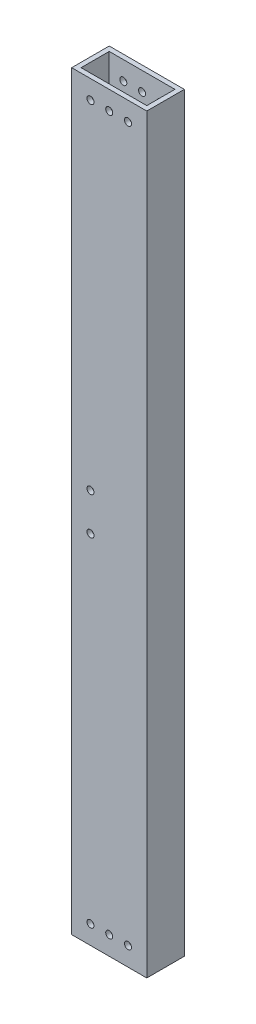
ISO-10303-21;
HEADER;
FILE_DESCRIPTION(('STEP AP214'),'2;1');
FILE_NAME('part.step','',(''),(''),'','','');
FILE_SCHEMA(('AUTOMOTIVE_DESIGN { 1 0 10303 214 1 1 1 1 }'));
ENDSEC;
DATA;
#1=APPLICATION_CONTEXT('core data for automotive mechanical design processes');
#2=APPLICATION_PROTOCOL_DEFINITION('international standard','automotive_design',2000,#1);
#3=PRODUCT_CONTEXT('',#1,'mechanical');
#4=PRODUCT('Part','Part','',(#3));
#5=PRODUCT_RELATED_PRODUCT_CATEGORY('part','',(#4));
#6=PRODUCT_DEFINITION_FORMATION('','',#4);
#7=PRODUCT_DEFINITION_CONTEXT('part definition',#1,'design');
#8=PRODUCT_DEFINITION('design','',#6,#7);
#9=PRODUCT_DEFINITION_SHAPE('','',#8);
#10=(LENGTH_UNIT() NAMED_UNIT(*) SI_UNIT(.MILLI.,.METRE.));
#11=(NAMED_UNIT(*) PLANE_ANGLE_UNIT() SI_UNIT($,.RADIAN.));
#12=(NAMED_UNIT(*) SI_UNIT($,.STERADIAN.) SOLID_ANGLE_UNIT());
#13=UNCERTAINTY_MEASURE_WITH_UNIT(LENGTH_MEASURE(1.E-05),#10,'distance_accuracy_value','');
#14=(GEOMETRIC_REPRESENTATION_CONTEXT(3) GLOBAL_UNCERTAINTY_ASSIGNED_CONTEXT((#13)) GLOBAL_UNIT_ASSIGNED_CONTEXT((#10,
#11,#12)) REPRESENTATION_CONTEXT('',''));
#15=CARTESIAN_POINT('',(0.,0.,0.));
#16=DIRECTION('',(0.,0.,1.));
#17=DIRECTION('',(1.,0.,0.));
#18=AXIS2_PLACEMENT_3D('',#15,#16,#17);
#19=CARTESIAN_POINT('',(25.4,254.,-12.7));
#20=DIRECTION('',(-1.,0.,0.));
#21=DIRECTION('',(0.,0.,1.));
#22=AXIS2_PLACEMENT_3D('',#19,#20,#21);
#23=PLANE('',#22);
#24=DIRECTION('',(0.,0.,-1.));
#25=VECTOR('',#24,1.);
#26=CARTESIAN_POINT('',(25.4,-254.,-12.7));
#27=LINE('',#26,#25);
#28=CARTESIAN_POINT('',(25.4,-254.,12.7));
#29=VERTEX_POINT('',#28);
#30=CARTESIAN_POINT('',(25.4,-254.,-12.7));
#31=VERTEX_POINT('',#30);
#32=EDGE_CURVE('E148',#29,#31,#27,.T.);
#33=ORIENTED_EDGE('',*,*,#32,.T.);
#34=DIRECTION('',(0.,-1.,0.));
#35=VECTOR('',#34,1.);
#36=CARTESIAN_POINT('',(25.4,254.,-12.7));
#37=LINE('',#36,#35);
#38=CARTESIAN_POINT('',(25.4,254.,-12.7));
#39=VERTEX_POINT('',#38);
#40=EDGE_CURVE('E11',#39,#31,#37,.T.);
#41=ORIENTED_EDGE('',*,*,#40,.F.);
#42=DIRECTION('',(0.,0.,-1.));
#43=VECTOR('',#42,1.);
#44=CARTESIAN_POINT('',(25.4,254.,-12.7));
#45=LINE('',#44,#43);
#46=CARTESIAN_POINT('',(25.4,254.,12.7));
#47=VERTEX_POINT('',#46);
#48=EDGE_CURVE('E137',#47,#39,#45,.T.);
#49=ORIENTED_EDGE('',*,*,#48,.F.);
#50=DIRECTION('',(0.,-1.,0.));
#51=VECTOR('',#50,1.);
#52=CARTESIAN_POINT('',(25.4,254.,12.7));
#53=LINE('',#52,#51);
#54=EDGE_CURVE('E147',#47,#29,#53,.T.);
#55=ORIENTED_EDGE('',*,*,#54,.T.);
#56=EDGE_LOOP('',(#33,#41,#49,#55));
#57=FACE_BOUND('',#56,.T.);
#58=ADVANCED_FACE('F37',(#57),#23,.F.);
#59=CARTESIAN_POINT('',(-25.4,254.,-12.7));
#60=DIRECTION('',(0.,0.,1.));
#61=DIRECTION('',(1.,0.,0.));
#62=AXIS2_PLACEMENT_3D('',#59,#60,#61);
#63=PLANE('',#62);
#64=CARTESIAN_POINT('',(-12.7,-241.3,-12.7));
#65=DIRECTION('',(0.,0.,-1.));
#66=DIRECTION('',(-1.,0.,0.));
#67=AXIS2_PLACEMENT_3D('',#64,#65,#66);
#68=CIRCLE('',#67,2.38125);
#69=CARTESIAN_POINT('',(-15.08125,-241.3,-12.7));
#70=VERTEX_POINT('',#69);
#71=EDGE_CURVE('E362',#70,#70,#68,.T.);
#72=ORIENTED_EDGE('',*,*,#71,.F.);
#73=EDGE_LOOP('',(#72));
#74=FACE_BOUND('',#73,.T.);
#75=CARTESIAN_POINT('',(12.7,-241.3,-12.7));
#76=DIRECTION('',(0.,0.,-1.));
#77=DIRECTION('',(-1.,0.,0.));
#78=AXIS2_PLACEMENT_3D('',#75,#76,#77);
#79=CIRCLE('',#78,2.38125);
#80=CARTESIAN_POINT('',(10.31875,-241.3,-12.7));
#81=VERTEX_POINT('',#80);
#82=EDGE_CURVE('E390',#81,#81,#79,.T.);
#83=ORIENTED_EDGE('',*,*,#82,.F.);
#84=EDGE_LOOP('',(#83));
#85=FACE_BOUND('',#84,.T.);
#86=CARTESIAN_POINT('',(12.6999999999999,241.3,-12.7));
#87=DIRECTION('',(0.,0.,-1.));
#88=DIRECTION('',(1.,0.,0.));
#89=AXIS2_PLACEMENT_3D('',#86,#87,#88);
#90=CIRCLE('',#89,2.38125);
#91=CARTESIAN_POINT('',(15.0812499999999,241.3,-12.7));
#92=VERTEX_POINT('',#91);
#93=EDGE_CURVE('E396',#92,#92,#90,.T.);
#94=ORIENTED_EDGE('',*,*,#93,.F.);
#95=EDGE_LOOP('',(#94));
#96=FACE_BOUND('',#95,.T.);
#97=CARTESIAN_POINT('',(-12.6999999999999,241.3,-12.7));
#98=DIRECTION('',(0.,0.,-1.));
#99=DIRECTION('',(1.,0.,0.));
#100=AXIS2_PLACEMENT_3D('',#97,#98,#99);
#101=CIRCLE('',#100,2.38125);
#102=CARTESIAN_POINT('',(-10.3187499999999,241.3,-12.7));
#103=VERTEX_POINT('',#102);
#104=EDGE_CURVE('E384',#103,#103,#101,.T.);
#105=ORIENTED_EDGE('',*,*,#104,.F.);
#106=EDGE_LOOP('',(#105));
#107=FACE_BOUND('',#106,.T.);
#108=CARTESIAN_POINT('',(0.,241.3,-12.7));
#109=DIRECTION('',(0.,0.,-1.));
#110=DIRECTION('',(1.,0.,0.));
#111=AXIS2_PLACEMENT_3D('',#108,#109,#110);
#112=CIRCLE('',#111,2.38125);
#113=CARTESIAN_POINT('',(2.38125000000006,241.3,-12.7));
#114=VERTEX_POINT('',#113);
#115=EDGE_CURVE('E378',#114,#114,#112,.T.);
#116=ORIENTED_EDGE('',*,*,#115,.F.);
#117=EDGE_LOOP('',(#116));
#118=FACE_BOUND('',#117,.T.);
#119=CARTESIAN_POINT('',(0.,-241.3,-12.7));
#120=DIRECTION('',(0.,0.,-1.));
#121=DIRECTION('',(-1.,0.,0.));
#122=AXIS2_PLACEMENT_3D('',#119,#120,#121);
#123=CIRCLE('',#122,2.38125);
#124=CARTESIAN_POINT('',(-2.38125,-241.3,-12.7));
#125=VERTEX_POINT('',#124);
#126=EDGE_CURVE('E360',#125,#125,#123,.T.);
#127=ORIENTED_EDGE('',*,*,#126,.F.);
#128=EDGE_LOOP('',(#127));
#129=FACE_BOUND('',#128,.T.);
#130=CARTESIAN_POINT('',(-12.7,-12.7,-12.7));
#131=DIRECTION('',(0.,0.,-1.));
#132=DIRECTION('',(-1.,0.,0.));
#133=AXIS2_PLACEMENT_3D('',#130,#131,#132);
#134=CIRCLE('',#133,2.38125);
#135=CARTESIAN_POINT('',(-15.08125,-12.7,-12.7));
#136=VERTEX_POINT('',#135);
#137=EDGE_CURVE('E207',#136,#136,#134,.T.);
#138=ORIENTED_EDGE('',*,*,#137,.F.);
#139=EDGE_LOOP('',(#138));
#140=FACE_BOUND('',#139,.T.);
#141=CARTESIAN_POINT('',(-12.7,12.7,-12.7));
#142=DIRECTION('',(0.,0.,-1.));
#143=DIRECTION('',(-1.,0.,0.));
#144=AXIS2_PLACEMENT_3D('',#141,#142,#143);
#145=CIRCLE('',#144,2.38125);
#146=CARTESIAN_POINT('',(-15.08125,12.7,-12.7));
#147=VERTEX_POINT('',#146);
#148=EDGE_CURVE('E210',#147,#147,#145,.T.);
#149=ORIENTED_EDGE('',*,*,#148,.F.);
#150=EDGE_LOOP('',(#149));
#151=FACE_BOUND('',#150,.T.);
#152=DIRECTION('',(-1.,0.,0.));
#153=VECTOR('',#152,1.);
#154=CARTESIAN_POINT('',(-25.4,-254.,-12.7));
#155=LINE('',#154,#153);
#156=CARTESIAN_POINT('',(-25.4,-254.,-12.7));
#157=VERTEX_POINT('',#156);
#158=EDGE_CURVE('E151',#31,#157,#155,.T.);
#159=ORIENTED_EDGE('',*,*,#158,.T.);
#160=DIRECTION('',(0.,-1.,0.));
#161=VECTOR('',#160,1.);
#162=CARTESIAN_POINT('',(-25.4,254.,-12.7));
#163=LINE('',#162,#161);
#164=CARTESIAN_POINT('',(-25.4,254.,-12.7));
#165=VERTEX_POINT('',#164);
#166=EDGE_CURVE('E45',#165,#157,#163,.T.);
#167=ORIENTED_EDGE('',*,*,#166,.F.);
#168=DIRECTION('',(-1.,0.,0.));
#169=VECTOR('',#168,1.);
#170=CARTESIAN_POINT('',(-25.4,254.,-12.7));
#171=LINE('',#170,#169);
#172=EDGE_CURVE('E140',#39,#165,#171,.T.);
#173=ORIENTED_EDGE('',*,*,#172,.F.);
#174=ORIENTED_EDGE('',*,*,#40,.T.);
#175=EDGE_LOOP('',(#159,#167,#173,#174));
#176=FACE_BOUND('',#175,.T.);
#177=ADVANCED_FACE('F241',(#74,#85,#96,#107,#118,#129,#140,#151,#176),#63,.F.);
#178=CARTESIAN_POINT('',(-25.4,254.,-12.7));
#179=DIRECTION('',(1.,0.,0.));
#180=DIRECTION('',(0.,0.,-1.));
#181=AXIS2_PLACEMENT_3D('',#178,#179,#180);
#182=PLANE('',#181);
#183=DIRECTION('',(0.,0.,1.));
#184=VECTOR('',#183,1.);
#185=CARTESIAN_POINT('',(-25.4,-254.,-12.7));
#186=LINE('',#185,#184);
#187=CARTESIAN_POINT('',(-25.4,-254.,12.7));
#188=VERTEX_POINT('',#187);
#189=EDGE_CURVE('E153',#157,#188,#186,.T.);
#190=ORIENTED_EDGE('',*,*,#189,.T.);
#191=DIRECTION('',(0.,-1.,0.));
#192=VECTOR('',#191,1.);
#193=CARTESIAN_POINT('',(-25.4,254.,12.7));
#194=LINE('',#193,#192);
#195=CARTESIAN_POINT('',(-25.4,254.,12.7));
#196=VERTEX_POINT('',#195);
#197=EDGE_CURVE('E158',#196,#188,#194,.T.);
#198=ORIENTED_EDGE('',*,*,#197,.F.);
#199=DIRECTION('',(0.,0.,1.));
#200=VECTOR('',#199,1.);
#201=CARTESIAN_POINT('',(-25.4,254.,-12.7));
#202=LINE('',#201,#200);
#203=EDGE_CURVE('E143',#165,#196,#202,.T.);
#204=ORIENTED_EDGE('',*,*,#203,.F.);
#205=ORIENTED_EDGE('',*,*,#166,.T.);
#206=EDGE_LOOP('',(#190,#198,#204,#205));
#207=FACE_BOUND('',#206,.T.);
#208=ADVANCED_FACE('F246',(#207),#182,.F.);
#209=CARTESIAN_POINT('',(-25.4,254.,12.7));
#210=DIRECTION('',(0.,0.,-1.));
#211=DIRECTION('',(-1.,0.,0.));
#212=AXIS2_PLACEMENT_3D('',#209,#210,#211);
#213=PLANE('',#212);
#214=CARTESIAN_POINT('',(-12.7,-241.3,12.7));
#215=DIRECTION('',(0.,0.,-1.));
#216=DIRECTION('',(-1.,0.,0.));
#217=AXIS2_PLACEMENT_3D('',#214,#215,#216);
#218=CIRCLE('',#217,2.38125);
#219=CARTESIAN_POINT('',(-15.08125,-241.3,12.7));
#220=VERTEX_POINT('',#219);
#221=EDGE_CURVE('E367',#220,#220,#218,.T.);
#222=ORIENTED_EDGE('',*,*,#221,.T.);
#223=EDGE_LOOP('',(#222));
#224=FACE_BOUND('',#223,.T.);
#225=CARTESIAN_POINT('',(12.7,-241.3,12.7));
#226=DIRECTION('',(0.,0.,-1.));
#227=DIRECTION('',(-1.,0.,0.));
#228=AXIS2_PLACEMENT_3D('',#225,#226,#227);
#229=CIRCLE('',#228,2.38125);
#230=CARTESIAN_POINT('',(10.31875,-241.3,12.7));
#231=VERTEX_POINT('',#230);
#232=EDGE_CURVE('E393',#231,#231,#229,.T.);
#233=ORIENTED_EDGE('',*,*,#232,.T.);
#234=EDGE_LOOP('',(#233));
#235=FACE_BOUND('',#234,.T.);
#236=CARTESIAN_POINT('',(12.6999999999999,241.3,12.7));
#237=DIRECTION('',(0.,0.,-1.));
#238=DIRECTION('',(1.,0.,0.));
#239=AXIS2_PLACEMENT_3D('',#236,#237,#238);
#240=CIRCLE('',#239,2.38125);
#241=CARTESIAN_POINT('',(15.0812499999999,241.3,12.7));
#242=VERTEX_POINT('',#241);
#243=EDGE_CURVE('E399',#242,#242,#240,.T.);
#244=ORIENTED_EDGE('',*,*,#243,.T.);
#245=EDGE_LOOP('',(#244));
#246=FACE_BOUND('',#245,.T.);
#247=CARTESIAN_POINT('',(-12.6999999999999,241.3,12.7));
#248=DIRECTION('',(0.,0.,-1.));
#249=DIRECTION('',(1.,0.,0.));
#250=AXIS2_PLACEMENT_3D('',#247,#248,#249);
#251=CIRCLE('',#250,2.38125);
#252=CARTESIAN_POINT('',(-10.3187499999999,241.3,12.7));
#253=VERTEX_POINT('',#252);
#254=EDGE_CURVE('E380',#253,#253,#251,.T.);
#255=ORIENTED_EDGE('',*,*,#254,.T.);
#256=EDGE_LOOP('',(#255));
#257=FACE_BOUND('',#256,.T.);
#258=CARTESIAN_POINT('',(0.,241.3,12.7));
#259=DIRECTION('',(0.,0.,-1.));
#260=DIRECTION('',(1.,0.,0.));
#261=AXIS2_PLACEMENT_3D('',#258,#259,#260);
#262=CIRCLE('',#261,2.38125);
#263=CARTESIAN_POINT('',(2.38125000000006,241.3,12.7));
#264=VERTEX_POINT('',#263);
#265=EDGE_CURVE('E381',#264,#264,#262,.T.);
#266=ORIENTED_EDGE('',*,*,#265,.T.);
#267=EDGE_LOOP('',(#266));
#268=FACE_BOUND('',#267,.T.);
#269=CARTESIAN_POINT('',(0.,-241.3,12.7));
#270=DIRECTION('',(0.,0.,-1.));
#271=DIRECTION('',(-1.,0.,0.));
#272=AXIS2_PLACEMENT_3D('',#269,#270,#271);
#273=CIRCLE('',#272,2.38125);
#274=CARTESIAN_POINT('',(-2.38125,-241.3,12.7));
#275=VERTEX_POINT('',#274);
#276=EDGE_CURVE('E175',#275,#275,#273,.T.);
#277=ORIENTED_EDGE('',*,*,#276,.T.);
#278=EDGE_LOOP('',(#277));
#279=FACE_BOUND('',#278,.T.);
#280=CARTESIAN_POINT('',(-12.7,-12.7,12.7));
#281=DIRECTION('',(0.,0.,-1.));
#282=DIRECTION('',(-1.,0.,0.));
#283=AXIS2_PLACEMENT_3D('',#280,#281,#282);
#284=CIRCLE('',#283,2.38125);
#285=CARTESIAN_POINT('',(-15.08125,-12.7,12.7));
#286=VERTEX_POINT('',#285);
#287=EDGE_CURVE('E167',#286,#286,#284,.T.);
#288=ORIENTED_EDGE('',*,*,#287,.T.);
#289=EDGE_LOOP('',(#288));
#290=FACE_BOUND('',#289,.T.);
#291=CARTESIAN_POINT('',(-12.7,12.7,12.7));
#292=DIRECTION('',(0.,0.,-1.));
#293=DIRECTION('',(-1.,0.,0.));
#294=AXIS2_PLACEMENT_3D('',#291,#292,#293);
#295=CIRCLE('',#294,2.38125);
#296=CARTESIAN_POINT('',(-15.08125,12.7,12.7));
#297=VERTEX_POINT('',#296);
#298=EDGE_CURVE('E204',#297,#297,#295,.T.);
#299=ORIENTED_EDGE('',*,*,#298,.T.);
#300=EDGE_LOOP('',(#299));
#301=FACE_BOUND('',#300,.T.);
#302=DIRECTION('',(1.,0.,0.));
#303=VECTOR('',#302,1.);
#304=CARTESIAN_POINT('',(-25.4,-254.,12.7));
#305=LINE('',#304,#303);
#306=EDGE_CURVE('E141',#188,#29,#305,.T.);
#307=ORIENTED_EDGE('',*,*,#306,.T.);
#308=ORIENTED_EDGE('',*,*,#54,.F.);
#309=DIRECTION('',(1.,0.,0.));
#310=VECTOR('',#309,1.);
#311=CARTESIAN_POINT('',(-25.4,254.,12.7));
#312=LINE('',#311,#310);
#313=EDGE_CURVE('E145',#196,#47,#312,.T.);
#314=ORIENTED_EDGE('',*,*,#313,.F.);
#315=ORIENTED_EDGE('',*,*,#197,.T.);
#316=EDGE_LOOP('',(#307,#308,#314,#315));
#317=FACE_BOUND('',#316,.T.);
#318=ADVANCED_FACE('F260',(#224,#235,#246,#257,#268,#279,#290,#301,#317),#213,.F.);
#319=CARTESIAN_POINT('',(0.,254.,0.));
#320=DIRECTION('',(0.,1.,0.));
#321=DIRECTION('',(0.,0.,1.));
#322=AXIS2_PLACEMENT_3D('',#319,#320,#321);
#323=PLANE('',#322);
#324=DIRECTION('',(0.,0.,-1.));
#325=VECTOR('',#324,1.);
#326=CARTESIAN_POINT('',(22.225,254.,-12.7));
#327=LINE('',#326,#325);
#328=CARTESIAN_POINT('',(22.225,254.,9.525));
#329=VERTEX_POINT('',#328);
#330=CARTESIAN_POINT('',(22.225,254.,-9.525));
#331=VERTEX_POINT('',#330);
#332=EDGE_CURVE('E125',#329,#331,#327,.T.);
#333=ORIENTED_EDGE('',*,*,#332,.F.);
#334=DIRECTION('',(1.,0.,0.));
#335=VECTOR('',#334,1.);
#336=CARTESIAN_POINT('',(-25.4,254.,9.525));
#337=LINE('',#336,#335);
#338=CARTESIAN_POINT('',(-22.225,254.,9.525));
#339=VERTEX_POINT('',#338);
#340=EDGE_CURVE('E108',#339,#329,#337,.T.);
#341=ORIENTED_EDGE('',*,*,#340,.F.);
#342=DIRECTION('',(0.,0.,1.));
#343=VECTOR('',#342,1.);
#344=CARTESIAN_POINT('',(-22.225,254.,-12.7));
#345=LINE('',#344,#343);
#346=CARTESIAN_POINT('',(-22.225,254.,-9.525));
#347=VERTEX_POINT('',#346);
#348=EDGE_CURVE('E134',#347,#339,#345,.T.);
#349=ORIENTED_EDGE('',*,*,#348,.F.);
#350=DIRECTION('',(-1.,0.,0.));
#351=VECTOR('',#350,1.);
#352=CARTESIAN_POINT('',(-25.4,254.,-9.525));
#353=LINE('',#352,#351);
#354=EDGE_CURVE('E127',#331,#347,#353,.T.);
#355=ORIENTED_EDGE('',*,*,#354,.F.);
#356=EDGE_LOOP('',(#333,#341,#349,#355));
#357=FACE_BOUND('',#356,.T.);
#358=ORIENTED_EDGE('',*,*,#48,.T.);
#359=ORIENTED_EDGE('',*,*,#172,.T.);
#360=ORIENTED_EDGE('',*,*,#203,.T.);
#361=ORIENTED_EDGE('',*,*,#313,.T.);
#362=EDGE_LOOP('',(#358,#359,#360,#361));
#363=FACE_BOUND('',#362,.T.);
#364=ADVANCED_FACE('F225',(#357,#363),#323,.T.);
#365=CARTESIAN_POINT('',(0.,-254.,0.));
#366=DIRECTION('',(0.,1.,0.));
#367=DIRECTION('',(0.,0.,1.));
#368=AXIS2_PLACEMENT_3D('',#365,#366,#367);
#369=PLANE('',#368);
#370=DIRECTION('',(1.,0.,0.));
#371=VECTOR('',#370,1.);
#372=CARTESIAN_POINT('',(-25.4,-254.,9.525));
#373=LINE('',#372,#371);
#374=CARTESIAN_POINT('',(-22.225,-254.,9.525));
#375=VERTEX_POINT('',#374);
#376=CARTESIAN_POINT('',(22.225,-254.,9.525));
#377=VERTEX_POINT('',#376);
#378=EDGE_CURVE('E106',#375,#377,#373,.T.);
#379=ORIENTED_EDGE('',*,*,#378,.T.);
#380=DIRECTION('',(0.,0.,-1.));
#381=VECTOR('',#380,1.);
#382=CARTESIAN_POINT('',(22.225,-254.,-12.7));
#383=LINE('',#382,#381);
#384=CARTESIAN_POINT('',(22.225,-254.,-9.525));
#385=VERTEX_POINT('',#384);
#386=EDGE_CURVE('E114',#377,#385,#383,.T.);
#387=ORIENTED_EDGE('',*,*,#386,.T.);
#388=DIRECTION('',(-1.,0.,0.));
#389=VECTOR('',#388,1.);
#390=CARTESIAN_POINT('',(-25.4,-254.,-9.525));
#391=LINE('',#390,#389);
#392=CARTESIAN_POINT('',(-22.225,-254.,-9.525));
#393=VERTEX_POINT('',#392);
#394=EDGE_CURVE('E120',#385,#393,#391,.T.);
#395=ORIENTED_EDGE('',*,*,#394,.T.);
#396=DIRECTION('',(0.,0.,1.));
#397=VECTOR('',#396,1.);
#398=CARTESIAN_POINT('',(-22.225,-254.,-12.7));
#399=LINE('',#398,#397);
#400=EDGE_CURVE('E60',#393,#375,#399,.T.);
#401=ORIENTED_EDGE('',*,*,#400,.T.);
#402=EDGE_LOOP('',(#379,#387,#395,#401));
#403=FACE_BOUND('',#402,.T.);
#404=ORIENTED_EDGE('',*,*,#32,.F.);
#405=ORIENTED_EDGE('',*,*,#306,.F.);
#406=ORIENTED_EDGE('',*,*,#189,.F.);
#407=ORIENTED_EDGE('',*,*,#158,.F.);
#408=EDGE_LOOP('',(#404,#405,#406,#407));
#409=FACE_BOUND('',#408,.T.);
#410=ADVANCED_FACE('F123',(#403,#409),#369,.F.);
#411=CARTESIAN_POINT('',(22.225,254.,-12.7));
#412=DIRECTION('',(-1.,0.,0.));
#413=DIRECTION('',(0.,0.,1.));
#414=AXIS2_PLACEMENT_3D('',#411,#412,#413);
#415=PLANE('',#414);
#416=ORIENTED_EDGE('',*,*,#386,.F.);
#417=DIRECTION('',(0.,-1.,0.));
#418=VECTOR('',#417,1.);
#419=CARTESIAN_POINT('',(22.225,254.,9.525));
#420=LINE('',#419,#418);
#421=EDGE_CURVE('E102',#329,#377,#420,.T.);
#422=ORIENTED_EDGE('',*,*,#421,.F.);
#423=ORIENTED_EDGE('',*,*,#332,.T.);
#424=DIRECTION('',(0.,-1.,0.));
#425=VECTOR('',#424,1.);
#426=CARTESIAN_POINT('',(22.225,254.,-9.525));
#427=LINE('',#426,#425);
#428=EDGE_CURVE('E117',#331,#385,#427,.T.);
#429=ORIENTED_EDGE('',*,*,#428,.T.);
#430=EDGE_LOOP('',(#416,#422,#423,#429));
#431=FACE_BOUND('',#430,.T.);
#432=ADVANCED_FACE('F115',(#431),#415,.T.);
#433=CARTESIAN_POINT('',(-25.4,254.,-9.525));
#434=DIRECTION('',(0.,0.,1.));
#435=DIRECTION('',(1.,0.,0.));
#436=AXIS2_PLACEMENT_3D('',#433,#434,#435);
#437=PLANE('',#436);
#438=CARTESIAN_POINT('',(-12.7,-241.3,-9.525));
#439=DIRECTION('',(0.,0.,1.));
#440=DIRECTION('',(1.,0.,0.));
#441=AXIS2_PLACEMENT_3D('',#438,#439,#440);
#442=CIRCLE('',#441,2.38125);
#443=CARTESIAN_POINT('',(-10.31875,-241.3,-9.525));
#444=VERTEX_POINT('',#443);
#445=EDGE_CURVE('E201',#444,#444,#442,.T.);
#446=ORIENTED_EDGE('',*,*,#445,.F.);
#447=EDGE_LOOP('',(#446));
#448=FACE_BOUND('',#447,.T.);
#449=CARTESIAN_POINT('',(12.7,-241.3,-9.525));
#450=DIRECTION('',(0.,0.,1.));
#451=DIRECTION('',(1.,0.,0.));
#452=AXIS2_PLACEMENT_3D('',#449,#450,#451);
#453=CIRCLE('',#452,2.38125);
#454=CARTESIAN_POINT('',(15.08125,-241.3,-9.525));
#455=VERTEX_POINT('',#454);
#456=EDGE_CURVE('E189',#455,#455,#453,.T.);
#457=ORIENTED_EDGE('',*,*,#456,.F.);
#458=EDGE_LOOP('',(#457));
#459=FACE_BOUND('',#458,.T.);
#460=CARTESIAN_POINT('',(12.6999999999999,241.3,-9.525));
#461=DIRECTION('',(0.,0.,1.));
#462=DIRECTION('',(1.,0.,0.));
#463=AXIS2_PLACEMENT_3D('',#460,#461,#462);
#464=CIRCLE('',#463,2.38125);
#465=CARTESIAN_POINT('',(15.0812499999999,241.3,-9.525));
#466=VERTEX_POINT('',#465);
#467=EDGE_CURVE('E186',#466,#466,#464,.T.);
#468=ORIENTED_EDGE('',*,*,#467,.F.);
#469=EDGE_LOOP('',(#468));
#470=FACE_BOUND('',#469,.T.);
#471=CARTESIAN_POINT('',(-12.6999999999999,241.3,-9.525));
#472=DIRECTION('',(0.,0.,1.));
#473=DIRECTION('',(1.,0.,0.));
#474=AXIS2_PLACEMENT_3D('',#471,#472,#473);
#475=CIRCLE('',#474,2.38125);
#476=CARTESIAN_POINT('',(-10.3187499999999,241.3,-9.525));
#477=VERTEX_POINT('',#476);
#478=EDGE_CURVE('E183',#477,#477,#475,.T.);
#479=ORIENTED_EDGE('',*,*,#478,.F.);
#480=EDGE_LOOP('',(#479));
#481=FACE_BOUND('',#480,.T.);
#482=CARTESIAN_POINT('',(0.,241.3,-9.525));
#483=DIRECTION('',(0.,0.,1.));
#484=DIRECTION('',(1.,0.,0.));
#485=AXIS2_PLACEMENT_3D('',#482,#483,#484);
#486=CIRCLE('',#485,2.38125);
#487=CARTESIAN_POINT('',(2.38125000000006,241.3,-9.525));
#488=VERTEX_POINT('',#487);
#489=EDGE_CURVE('E179',#488,#488,#486,.T.);
#490=ORIENTED_EDGE('',*,*,#489,.F.);
#491=EDGE_LOOP('',(#490));
#492=FACE_BOUND('',#491,.T.);
#493=CARTESIAN_POINT('',(0.,-241.3,-9.525));
#494=DIRECTION('',(0.,0.,1.));
#495=DIRECTION('',(1.,0.,0.));
#496=AXIS2_PLACEMENT_3D('',#493,#494,#495);
#497=CIRCLE('',#496,2.38125);
#498=CARTESIAN_POINT('',(2.38125,-241.3,-9.525));
#499=VERTEX_POINT('',#498);
#500=EDGE_CURVE('E174',#499,#499,#497,.T.);
#501=ORIENTED_EDGE('',*,*,#500,.F.);
#502=EDGE_LOOP('',(#501));
#503=FACE_BOUND('',#502,.T.);
#504=CARTESIAN_POINT('',(-12.7,-12.7,-9.525));
#505=DIRECTION('',(0.,0.,1.));
#506=DIRECTION('',(1.,0.,0.));
#507=AXIS2_PLACEMENT_3D('',#504,#505,#506);
#508=CIRCLE('',#507,2.38125);
#509=CARTESIAN_POINT('',(-10.31875,-12.7,-9.525));
#510=VERTEX_POINT('',#509);
#511=EDGE_CURVE('E121',#510,#510,#508,.T.);
#512=ORIENTED_EDGE('',*,*,#511,.F.);
#513=EDGE_LOOP('',(#512));
#514=FACE_BOUND('',#513,.T.);
#515=CARTESIAN_POINT('',(-12.7,12.7,-9.525));
#516=DIRECTION('',(0.,0.,1.));
#517=DIRECTION('',(1.,0.,0.));
#518=AXIS2_PLACEMENT_3D('',#515,#516,#517);
#519=CIRCLE('',#518,2.38125);
#520=CARTESIAN_POINT('',(-10.31875,12.7,-9.525));
#521=VERTEX_POINT('',#520);
#522=EDGE_CURVE('E166',#521,#521,#519,.T.);
#523=ORIENTED_EDGE('',*,*,#522,.F.);
#524=EDGE_LOOP('',(#523));
#525=FACE_BOUND('',#524,.T.);
#526=ORIENTED_EDGE('',*,*,#394,.F.);
#527=ORIENTED_EDGE('',*,*,#428,.F.);
#528=ORIENTED_EDGE('',*,*,#354,.T.);
#529=DIRECTION('',(0.,-1.,0.));
#530=VECTOR('',#529,1.);
#531=CARTESIAN_POINT('',(-22.225,254.,-9.525));
#532=LINE('',#531,#530);
#533=EDGE_CURVE('E219',#347,#393,#532,.T.);
#534=ORIENTED_EDGE('',*,*,#533,.T.);
#535=EDGE_LOOP('',(#526,#527,#528,#534));
#536=FACE_BOUND('',#535,.T.);
#537=ADVANCED_FACE('F228',(#448,#459,#470,#481,#492,#503,#514,#525,#536),#437,.T.);
#538=CARTESIAN_POINT('',(-22.225,254.,-12.7));
#539=DIRECTION('',(1.,0.,0.));
#540=DIRECTION('',(0.,0.,-1.));
#541=AXIS2_PLACEMENT_3D('',#538,#539,#540);
#542=PLANE('',#541);
#543=ORIENTED_EDGE('',*,*,#400,.F.);
#544=ORIENTED_EDGE('',*,*,#533,.F.);
#545=ORIENTED_EDGE('',*,*,#348,.T.);
#546=DIRECTION('',(0.,-1.,0.));
#547=VECTOR('',#546,1.);
#548=CARTESIAN_POINT('',(-22.225,254.,9.525));
#549=LINE('',#548,#547);
#550=EDGE_CURVE('E53',#339,#375,#549,.T.);
#551=ORIENTED_EDGE('',*,*,#550,.T.);
#552=EDGE_LOOP('',(#543,#544,#545,#551));
#553=FACE_BOUND('',#552,.T.);
#554=ADVANCED_FACE('F221',(#553),#542,.T.);
#555=CARTESIAN_POINT('',(-25.4,254.,9.525));
#556=DIRECTION('',(0.,0.,-1.));
#557=DIRECTION('',(-1.,0.,0.));
#558=AXIS2_PLACEMENT_3D('',#555,#556,#557);
#559=PLANE('',#558);
#560=CARTESIAN_POINT('',(-12.7,-241.3,9.525));
#561=DIRECTION('',(0.,0.,-1.));
#562=DIRECTION('',(-1.,0.,0.));
#563=AXIS2_PLACEMENT_3D('',#560,#561,#562);
#564=CIRCLE('',#563,2.38125);
#565=CARTESIAN_POINT('',(-15.08125,-241.3,9.525));
#566=VERTEX_POINT('',#565);
#567=EDGE_CURVE('E40',#566,#566,#564,.T.);
#568=ORIENTED_EDGE('',*,*,#567,.F.);
#569=EDGE_LOOP('',(#568));
#570=FACE_BOUND('',#569,.T.);
#571=CARTESIAN_POINT('',(12.7,-241.3,9.525));
#572=DIRECTION('',(0.,0.,-1.));
#573=DIRECTION('',(-1.,0.,0.));
#574=AXIS2_PLACEMENT_3D('',#571,#572,#573);
#575=CIRCLE('',#574,2.38125);
#576=CARTESIAN_POINT('',(10.31875,-241.3,9.525));
#577=VERTEX_POINT('',#576);
#578=EDGE_CURVE('E187',#577,#577,#575,.T.);
#579=ORIENTED_EDGE('',*,*,#578,.F.);
#580=EDGE_LOOP('',(#579));
#581=FACE_BOUND('',#580,.T.);
#582=CARTESIAN_POINT('',(12.6999999999999,241.3,9.525));
#583=DIRECTION('',(0.,0.,-1.));
#584=DIRECTION('',(-1.,0.,0.));
#585=AXIS2_PLACEMENT_3D('',#582,#583,#584);
#586=CIRCLE('',#585,2.38125);
#587=CARTESIAN_POINT('',(10.3187499999999,241.3,9.525));
#588=VERTEX_POINT('',#587);
#589=EDGE_CURVE('E184',#588,#588,#586,.T.);
#590=ORIENTED_EDGE('',*,*,#589,.F.);
#591=EDGE_LOOP('',(#590));
#592=FACE_BOUND('',#591,.T.);
#593=CARTESIAN_POINT('',(-12.6999999999999,241.3,9.525));
#594=DIRECTION('',(0.,0.,-1.));
#595=DIRECTION('',(-1.,0.,0.));
#596=AXIS2_PLACEMENT_3D('',#593,#594,#595);
#597=CIRCLE('',#596,2.38125);
#598=CARTESIAN_POINT('',(-15.0812499999999,241.3,9.525));
#599=VERTEX_POINT('',#598);
#600=EDGE_CURVE('E180',#599,#599,#597,.T.);
#601=ORIENTED_EDGE('',*,*,#600,.F.);
#602=EDGE_LOOP('',(#601));
#603=FACE_BOUND('',#602,.T.);
#604=CARTESIAN_POINT('',(0.,241.3,9.525));
#605=DIRECTION('',(0.,0.,-1.));
#606=DIRECTION('',(-1.,0.,0.));
#607=AXIS2_PLACEMENT_3D('',#604,#605,#606);
#608=CIRCLE('',#607,2.38125);
#609=CARTESIAN_POINT('',(-2.38124999999994,241.3,9.525));
#610=VERTEX_POINT('',#609);
#611=EDGE_CURVE('E176',#610,#610,#608,.T.);
#612=ORIENTED_EDGE('',*,*,#611,.F.);
#613=EDGE_LOOP('',(#612));
#614=FACE_BOUND('',#613,.T.);
#615=CARTESIAN_POINT('',(0.,-241.3,9.525));
#616=DIRECTION('',(0.,0.,-1.));
#617=DIRECTION('',(-1.,0.,0.));
#618=AXIS2_PLACEMENT_3D('',#615,#616,#617);
#619=CIRCLE('',#618,2.38125);
#620=CARTESIAN_POINT('',(-2.38125,-241.3,9.525));
#621=VERTEX_POINT('',#620);
#622=EDGE_CURVE('E171',#621,#621,#619,.T.);
#623=ORIENTED_EDGE('',*,*,#622,.F.);
#624=EDGE_LOOP('',(#623));
#625=FACE_BOUND('',#624,.T.);
#626=CARTESIAN_POINT('',(-12.7,-12.7,9.525));
#627=DIRECTION('',(0.,0.,-1.));
#628=DIRECTION('',(-1.,0.,0.));
#629=AXIS2_PLACEMENT_3D('',#626,#627,#628);
#630=CIRCLE('',#629,2.38125);
#631=CARTESIAN_POINT('',(-15.08125,-12.7,9.525));
#632=VERTEX_POINT('',#631);
#633=EDGE_CURVE('E168',#632,#632,#630,.T.);
#634=ORIENTED_EDGE('',*,*,#633,.F.);
#635=EDGE_LOOP('',(#634));
#636=FACE_BOUND('',#635,.T.);
#637=CARTESIAN_POINT('',(-12.7,12.7,9.525));
#638=DIRECTION('',(0.,0.,-1.));
#639=DIRECTION('',(-1.,0.,0.));
#640=AXIS2_PLACEMENT_3D('',#637,#638,#639);
#641=CIRCLE('',#640,2.38125);
#642=CARTESIAN_POINT('',(-15.08125,12.7,9.525));
#643=VERTEX_POINT('',#642);
#644=EDGE_CURVE('E163',#643,#643,#641,.T.);
#645=ORIENTED_EDGE('',*,*,#644,.F.);
#646=EDGE_LOOP('',(#645));
#647=FACE_BOUND('',#646,.T.);
#648=ORIENTED_EDGE('',*,*,#378,.F.);
#649=ORIENTED_EDGE('',*,*,#550,.F.);
#650=ORIENTED_EDGE('',*,*,#340,.T.);
#651=ORIENTED_EDGE('',*,*,#421,.T.);
#652=EDGE_LOOP('',(#648,#649,#650,#651));
#653=FACE_BOUND('',#652,.T.);
#654=ADVANCED_FACE('F104',(#570,#581,#592,#603,#614,#625,#636,#647,#653),#559,.T.);
#655=CARTESIAN_POINT('',(-12.7,12.7,12.7));
#656=DIRECTION('',(0.,0.,-1.));
#657=DIRECTION('',(-1.,0.,0.));
#658=AXIS2_PLACEMENT_3D('',#655,#656,#657);
#659=CYLINDRICAL_SURFACE('',#658,2.38125);
#660=ORIENTED_EDGE('',*,*,#644,.T.);
#661=EDGE_LOOP('',(#660));
#662=FACE_BOUND('',#661,.T.);
#663=ORIENTED_EDGE('',*,*,#298,.F.);
#664=EDGE_LOOP('',(#663));
#665=FACE_BOUND('',#664,.T.);
#666=ADVANCED_FACE('F275',(#662,#665),#659,.F.);
#667=CARTESIAN_POINT('',(-12.7,-12.7,12.7));
#668=DIRECTION('',(0.,0.,-1.));
#669=DIRECTION('',(-1.,0.,0.));
#670=AXIS2_PLACEMENT_3D('',#667,#668,#669);
#671=CYLINDRICAL_SURFACE('',#670,2.38125);
#672=ORIENTED_EDGE('',*,*,#633,.T.);
#673=EDGE_LOOP('',(#672));
#674=FACE_BOUND('',#673,.T.);
#675=ORIENTED_EDGE('',*,*,#287,.F.);
#676=EDGE_LOOP('',(#675));
#677=FACE_BOUND('',#676,.T.);
#678=ADVANCED_FACE('F280',(#674,#677),#671,.F.);
#679=ORIENTED_EDGE('',*,*,#522,.T.);
#680=EDGE_LOOP('',(#679));
#681=FACE_BOUND('',#680,.T.);
#682=ORIENTED_EDGE('',*,*,#148,.T.);
#683=EDGE_LOOP('',(#682));
#684=FACE_BOUND('',#683,.T.);
#685=ADVANCED_FACE('F283',(#681,#684),#659,.F.);
#686=ORIENTED_EDGE('',*,*,#511,.T.);
#687=EDGE_LOOP('',(#686));
#688=FACE_BOUND('',#687,.T.);
#689=ORIENTED_EDGE('',*,*,#137,.T.);
#690=EDGE_LOOP('',(#689));
#691=FACE_BOUND('',#690,.T.);
#692=ADVANCED_FACE('F306',(#688,#691),#671,.F.);
#693=CARTESIAN_POINT('',(0.,-241.3,12.7));
#694=DIRECTION('',(0.,0.,-1.));
#695=DIRECTION('',(-1.,0.,0.));
#696=AXIS2_PLACEMENT_3D('',#693,#694,#695);
#697=CYLINDRICAL_SURFACE('',#696,2.38125);
#698=ORIENTED_EDGE('',*,*,#622,.T.);
#699=EDGE_LOOP('',(#698));
#700=FACE_BOUND('',#699,.T.);
#701=ORIENTED_EDGE('',*,*,#276,.F.);
#702=EDGE_LOOP('',(#701));
#703=FACE_BOUND('',#702,.T.);
#704=ADVANCED_FACE('F315',(#700,#703),#697,.F.);
#705=CARTESIAN_POINT('',(0.,241.3,12.7));
#706=DIRECTION('',(0.,0.,-1.));
#707=DIRECTION('',(-1.,0.,0.));
#708=AXIS2_PLACEMENT_3D('',#705,#706,#707);
#709=CYLINDRICAL_SURFACE('',#708,2.38125);
#710=ORIENTED_EDGE('',*,*,#611,.T.);
#711=EDGE_LOOP('',(#710));
#712=FACE_BOUND('',#711,.T.);
#713=ORIENTED_EDGE('',*,*,#265,.F.);
#714=EDGE_LOOP('',(#713));
#715=FACE_BOUND('',#714,.T.);
#716=ADVANCED_FACE('F320',(#712,#715),#709,.F.);
#717=CARTESIAN_POINT('',(-12.6999999999999,241.3,12.7));
#718=DIRECTION('',(0.,0.,-1.));
#719=DIRECTION('',(-1.,0.,0.));
#720=AXIS2_PLACEMENT_3D('',#717,#718,#719);
#721=CYLINDRICAL_SURFACE('',#720,2.38125);
#722=ORIENTED_EDGE('',*,*,#600,.T.);
#723=EDGE_LOOP('',(#722));
#724=FACE_BOUND('',#723,.T.);
#725=ORIENTED_EDGE('',*,*,#254,.F.);
#726=EDGE_LOOP('',(#725));
#727=FACE_BOUND('',#726,.T.);
#728=ADVANCED_FACE('F336',(#724,#727),#721,.F.);
#729=CARTESIAN_POINT('',(12.6999999999999,241.3,12.7));
#730=DIRECTION('',(0.,0.,-1.));
#731=DIRECTION('',(-1.,0.,0.));
#732=AXIS2_PLACEMENT_3D('',#729,#730,#731);
#733=CYLINDRICAL_SURFACE('',#732,2.38125);
#734=ORIENTED_EDGE('',*,*,#589,.T.);
#735=EDGE_LOOP('',(#734));
#736=FACE_BOUND('',#735,.T.);
#737=ORIENTED_EDGE('',*,*,#243,.F.);
#738=EDGE_LOOP('',(#737));
#739=FACE_BOUND('',#738,.T.);
#740=ADVANCED_FACE('F414',(#736,#739),#733,.F.);
#741=CARTESIAN_POINT('',(12.7,-241.3,12.7));
#742=DIRECTION('',(0.,0.,-1.));
#743=DIRECTION('',(-1.,0.,0.));
#744=AXIS2_PLACEMENT_3D('',#741,#742,#743);
#745=CYLINDRICAL_SURFACE('',#744,2.38125);
#746=ORIENTED_EDGE('',*,*,#578,.T.);
#747=EDGE_LOOP('',(#746));
#748=FACE_BOUND('',#747,.T.);
#749=ORIENTED_EDGE('',*,*,#232,.F.);
#750=EDGE_LOOP('',(#749));
#751=FACE_BOUND('',#750,.T.);
#752=ADVANCED_FACE('F351',(#748,#751),#745,.F.);
#753=CARTESIAN_POINT('',(-12.7,-241.3,12.7));
#754=DIRECTION('',(0.,0.,-1.));
#755=DIRECTION('',(-1.,0.,0.));
#756=AXIS2_PLACEMENT_3D('',#753,#754,#755);
#757=CYLINDRICAL_SURFACE('',#756,2.38125);
#758=ORIENTED_EDGE('',*,*,#567,.T.);
#759=EDGE_LOOP('',(#758));
#760=FACE_BOUND('',#759,.T.);
#761=ORIENTED_EDGE('',*,*,#221,.F.);
#762=EDGE_LOOP('',(#761));
#763=FACE_BOUND('',#762,.T.);
#764=ADVANCED_FACE('F343',(#760,#763),#757,.F.);
#765=ORIENTED_EDGE('',*,*,#500,.T.);
#766=EDGE_LOOP('',(#765));
#767=FACE_BOUND('',#766,.T.);
#768=ORIENTED_EDGE('',*,*,#126,.T.);
#769=EDGE_LOOP('',(#768));
#770=FACE_BOUND('',#769,.T.);
#771=ADVANCED_FACE('F322',(#767,#770),#697,.F.);
#772=ORIENTED_EDGE('',*,*,#489,.T.);
#773=EDGE_LOOP('',(#772));
#774=FACE_BOUND('',#773,.T.);
#775=ORIENTED_EDGE('',*,*,#115,.T.);
#776=EDGE_LOOP('',(#775));
#777=FACE_BOUND('',#776,.T.);
#778=ADVANCED_FACE('F339',(#774,#777),#709,.F.);
#779=ORIENTED_EDGE('',*,*,#478,.T.);
#780=EDGE_LOOP('',(#779));
#781=FACE_BOUND('',#780,.T.);
#782=ORIENTED_EDGE('',*,*,#104,.T.);
#783=EDGE_LOOP('',(#782));
#784=FACE_BOUND('',#783,.T.);
#785=ADVANCED_FACE('F349',(#781,#784),#721,.F.);
#786=ORIENTED_EDGE('',*,*,#467,.T.);
#787=EDGE_LOOP('',(#786));
#788=FACE_BOUND('',#787,.T.);
#789=ORIENTED_EDGE('',*,*,#93,.T.);
#790=EDGE_LOOP('',(#789));
#791=FACE_BOUND('',#790,.T.);
#792=ADVANCED_FACE('F407',(#788,#791),#733,.F.);
#793=ORIENTED_EDGE('',*,*,#456,.T.);
#794=EDGE_LOOP('',(#793));
#795=FACE_BOUND('',#794,.T.);
#796=ORIENTED_EDGE('',*,*,#82,.T.);
#797=EDGE_LOOP('',(#796));
#798=FACE_BOUND('',#797,.T.);
#799=ADVANCED_FACE('F412',(#795,#798),#745,.F.);
#800=ORIENTED_EDGE('',*,*,#445,.T.);
#801=EDGE_LOOP('',(#800));
#802=FACE_BOUND('',#801,.T.);
#803=ORIENTED_EDGE('',*,*,#71,.T.);
#804=EDGE_LOOP('',(#803));
#805=FACE_BOUND('',#804,.T.);
#806=ADVANCED_FACE('F354',(#802,#805),#757,.F.);
#807=CLOSED_SHELL('',(#58,#177,#208,#318,#364,#410,#432,#537,#554,#654,#666,#678,#685,#692,#704,
#716,#728,#740,#752,#764,#771,#778,#785,#792,#799,#806));
#808=MANIFOLD_SOLID_BREP('B2',#807);
#809=ADVANCED_BREP_SHAPE_REPRESENTATION('',(#18,#808),#14);
#810=SHAPE_DEFINITION_REPRESENTATION(#9,#809);
ENDSEC;
END-ISO-10303-21;
